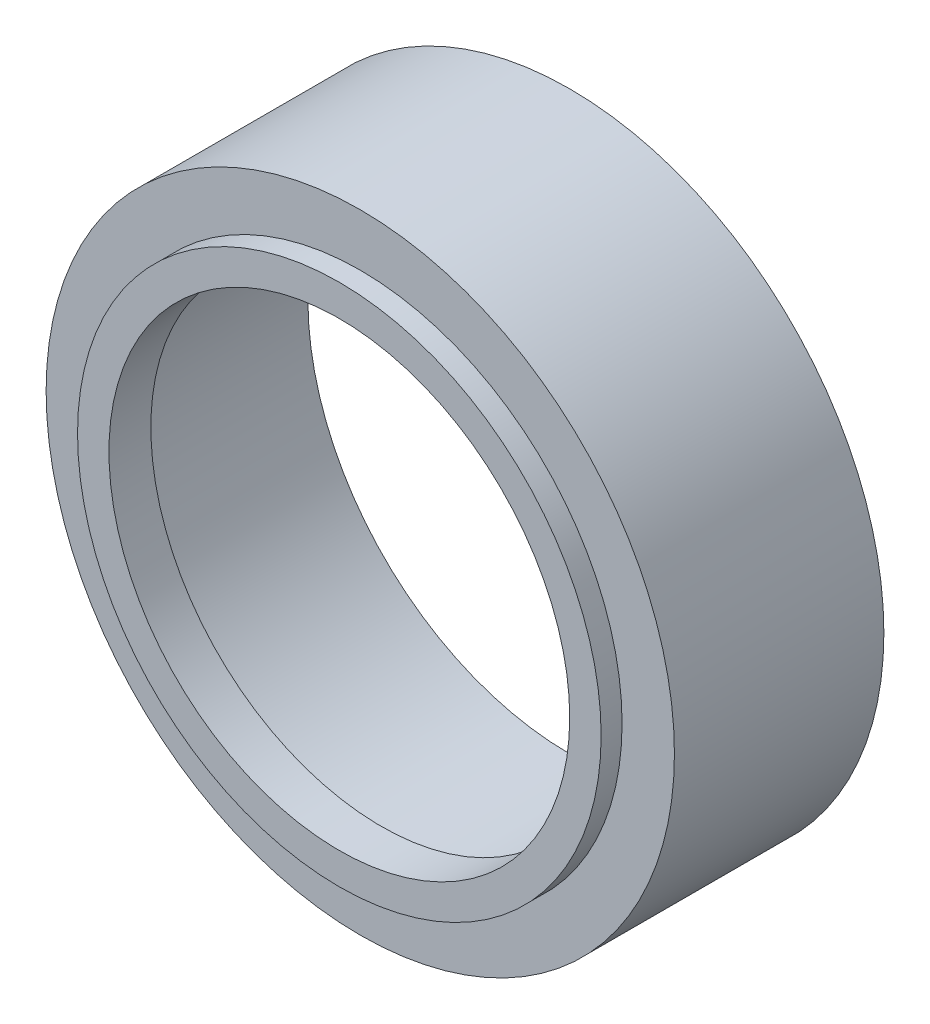
ISO-10303-21;
HEADER;
FILE_DESCRIPTION(('STEP AP214'),'2;1');
FILE_NAME('part.step','',(''),(''),'','','');
FILE_SCHEMA(('AUTOMOTIVE_DESIGN { 1 0 10303 214 1 1 1 1 }'));
ENDSEC;
DATA;
#1=APPLICATION_CONTEXT('core data for automotive mechanical design processes');
#2=APPLICATION_PROTOCOL_DEFINITION('international standard','automotive_design',2000,#1);
#3=PRODUCT_CONTEXT('',#1,'mechanical');
#4=PRODUCT('Part','Part','',(#3));
#5=PRODUCT_RELATED_PRODUCT_CATEGORY('part','',(#4));
#6=PRODUCT_DEFINITION_FORMATION('','',#4);
#7=PRODUCT_DEFINITION_CONTEXT('part definition',#1,'design');
#8=PRODUCT_DEFINITION('design','',#6,#7);
#9=PRODUCT_DEFINITION_SHAPE('','',#8);
#10=(LENGTH_UNIT() NAMED_UNIT(*) SI_UNIT(.MILLI.,.METRE.));
#11=(NAMED_UNIT(*) PLANE_ANGLE_UNIT() SI_UNIT($,.RADIAN.));
#12=(NAMED_UNIT(*) SI_UNIT($,.STERADIAN.) SOLID_ANGLE_UNIT());
#13=UNCERTAINTY_MEASURE_WITH_UNIT(LENGTH_MEASURE(1.E-05),#10,'distance_accuracy_value','');
#14=(GEOMETRIC_REPRESENTATION_CONTEXT(3) GLOBAL_UNCERTAINTY_ASSIGNED_CONTEXT((#13)) GLOBAL_UNIT_ASSIGNED_CONTEXT((#10,
#11,#12)) REPRESENTATION_CONTEXT('',''));
#15=CARTESIAN_POINT('',(0.,0.,0.));
#16=DIRECTION('',(0.,0.,1.));
#17=DIRECTION('',(1.,0.,0.));
#18=AXIS2_PLACEMENT_3D('',#15,#16,#17);
#19=CARTESIAN_POINT('',(0.,0.,10.));
#20=DIRECTION('',(0.,0.,-1.));
#21=DIRECTION('',(-1.,0.,0.));
#22=AXIS2_PLACEMENT_3D('',#19,#20,#21);
#23=CYLINDRICAL_SURFACE('',#22,15.);
#24=CARTESIAN_POINT('',(0.,0.,10.));
#25=DIRECTION('',(0.,0.,1.));
#26=DIRECTION('',(1.,0.,0.));
#27=AXIS2_PLACEMENT_3D('',#24,#25,#26);
#28=CIRCLE('',#27,15.);
#29=CARTESIAN_POINT('',(15.,0.,10.));
#30=VERTEX_POINT('',#29);
#31=EDGE_CURVE('E47',#30,#30,#28,.T.);
#32=ORIENTED_EDGE('',*,*,#31,.F.);
#33=EDGE_LOOP('',(#32));
#34=FACE_BOUND('',#33,.T.);
#35=CARTESIAN_POINT('',(0.,0.,0.));
#36=DIRECTION('',(0.,0.,1.));
#37=DIRECTION('',(1.,0.,0.));
#38=AXIS2_PLACEMENT_3D('',#35,#36,#37);
#39=CIRCLE('',#38,15.);
#40=CARTESIAN_POINT('',(15.,0.,0.));
#41=VERTEX_POINT('',#40);
#42=EDGE_CURVE('E42',#41,#41,#39,.T.);
#43=ORIENTED_EDGE('',*,*,#42,.T.);
#44=EDGE_LOOP('',(#43));
#45=FACE_BOUND('',#44,.T.);
#46=ADVANCED_FACE('F39',(#34,#45),#23,.T.);
#47=CARTESIAN_POINT('',(0.,0.,10.));
#48=DIRECTION('',(0.,0.,1.));
#49=DIRECTION('',(1.,0.,0.));
#50=AXIS2_PLACEMENT_3D('',#47,#48,#49);
#51=PLANE('',#50);
#52=CARTESIAN_POINT('',(0.,0.,10.));
#53=DIRECTION('',(0.,0.,1.));
#54=DIRECTION('',(1.,0.,0.));
#55=AXIS2_PLACEMENT_3D('',#52,#53,#54);
#56=CIRCLE('',#55,12.5);
#57=CARTESIAN_POINT('',(12.5,0.,10.));
#58=VERTEX_POINT('',#57);
#59=EDGE_CURVE('E10',#58,#58,#56,.T.);
#60=ORIENTED_EDGE('',*,*,#59,.F.);
#61=EDGE_LOOP('',(#60));
#62=FACE_BOUND('',#61,.T.);
#63=ORIENTED_EDGE('',*,*,#31,.T.);
#64=EDGE_LOOP('',(#63));
#65=FACE_BOUND('',#64,.T.);
#66=ADVANCED_FACE('F88',(#62,#65),#51,.T.);
#67=CARTESIAN_POINT('',(0.,0.,0.));
#68=DIRECTION('',(0.,0.,1.));
#69=DIRECTION('',(1.,0.,0.));
#70=AXIS2_PLACEMENT_3D('',#67,#68,#69);
#71=PLANE('',#70);
#72=CARTESIAN_POINT('',(0.,0.,0.));
#73=DIRECTION('',(0.,0.,-1.));
#74=DIRECTION('',(-1.,0.,0.));
#75=AXIS2_PLACEMENT_3D('',#72,#73,#74);
#76=CIRCLE('',#75,12.5);
#77=CARTESIAN_POINT('',(-12.5,0.,0.));
#78=VERTEX_POINT('',#77);
#79=EDGE_CURVE('E67',#78,#78,#76,.T.);
#80=ORIENTED_EDGE('',*,*,#79,.F.);
#81=EDGE_LOOP('',(#80));
#82=FACE_BOUND('',#81,.T.);
#83=ORIENTED_EDGE('',*,*,#42,.F.);
#84=EDGE_LOOP('',(#83));
#85=FACE_BOUND('',#84,.T.);
#86=ADVANCED_FACE('F84',(#82,#85),#71,.F.);
#87=CARTESIAN_POINT('',(0.,0.,11.));
#88=DIRECTION('',(0.,0.,-1.));
#89=DIRECTION('',(-1.,0.,0.));
#90=AXIS2_PLACEMENT_3D('',#87,#88,#89);
#91=CYLINDRICAL_SURFACE('',#90,12.5);
#92=CARTESIAN_POINT('',(0.,0.,11.));
#93=DIRECTION('',(0.,0.,1.));
#94=DIRECTION('',(1.,0.,0.));
#95=AXIS2_PLACEMENT_3D('',#92,#93,#94);
#96=CIRCLE('',#95,12.5);
#97=CARTESIAN_POINT('',(12.5,0.,11.));
#98=VERTEX_POINT('',#97);
#99=EDGE_CURVE('E54',#98,#98,#96,.T.);
#100=ORIENTED_EDGE('',*,*,#99,.F.);
#101=EDGE_LOOP('',(#100));
#102=FACE_BOUND('',#101,.T.);
#103=ORIENTED_EDGE('',*,*,#59,.T.);
#104=EDGE_LOOP('',(#103));
#105=FACE_BOUND('',#104,.T.);
#106=ADVANCED_FACE('F87',(#102,#105),#91,.T.);
#107=CARTESIAN_POINT('',(0.,0.,11.));
#108=DIRECTION('',(0.,0.,1.));
#109=DIRECTION('',(1.,0.,0.));
#110=AXIS2_PLACEMENT_3D('',#107,#108,#109);
#111=PLANE('',#110);
#112=CARTESIAN_POINT('',(0.,0.,11.));
#113=DIRECTION('',(0.,0.,1.));
#114=DIRECTION('',(1.,0.,0.));
#115=AXIS2_PLACEMENT_3D('',#112,#113,#114);
#116=CIRCLE('',#115,11.);
#117=CARTESIAN_POINT('',(11.,0.,11.));
#118=VERTEX_POINT('',#117);
#119=EDGE_CURVE('E58',#118,#118,#116,.T.);
#120=ORIENTED_EDGE('',*,*,#119,.F.);
#121=EDGE_LOOP('',(#120));
#122=FACE_BOUND('',#121,.T.);
#123=ORIENTED_EDGE('',*,*,#99,.T.);
#124=EDGE_LOOP('',(#123));
#125=FACE_BOUND('',#124,.T.);
#126=ADVANCED_FACE('F108',(#122,#125),#111,.T.);
#127=CARTESIAN_POINT('',(0.,0.,9.));
#128=DIRECTION('',(0.,0.,1.));
#129=DIRECTION('',(1.,0.,0.));
#130=AXIS2_PLACEMENT_3D('',#127,#128,#129);
#131=CYLINDRICAL_SURFACE('',#130,11.);
#132=CARTESIAN_POINT('',(0.,0.,9.));
#133=DIRECTION('',(0.,0.,1.));
#134=DIRECTION('',(1.,0.,0.));
#135=AXIS2_PLACEMENT_3D('',#132,#133,#134);
#136=CIRCLE('',#135,11.);
#137=CARTESIAN_POINT('',(11.,0.,9.));
#138=VERTEX_POINT('',#137);
#139=EDGE_CURVE('E62',#138,#138,#136,.T.);
#140=ORIENTED_EDGE('',*,*,#139,.F.);
#141=EDGE_LOOP('',(#140));
#142=FACE_BOUND('',#141,.T.);
#143=ORIENTED_EDGE('',*,*,#119,.T.);
#144=EDGE_LOOP('',(#143));
#145=FACE_BOUND('',#144,.T.);
#146=ADVANCED_FACE('F112',(#142,#145),#131,.F.);
#147=CARTESIAN_POINT('',(0.,0.,9.));
#148=DIRECTION('',(0.,0.,-1.));
#149=DIRECTION('',(-1.,0.,0.));
#150=AXIS2_PLACEMENT_3D('',#147,#148,#149);
#151=PLANE('',#150);
#152=CARTESIAN_POINT('',(0.,0.,9.));
#153=DIRECTION('',(0.,0.,-1.));
#154=DIRECTION('',(-1.,0.,0.));
#155=AXIS2_PLACEMENT_3D('',#152,#153,#154);
#156=CIRCLE('',#155,12.5);
#157=CARTESIAN_POINT('',(-12.5,0.,9.));
#158=VERTEX_POINT('',#157);
#159=EDGE_CURVE('E66',#158,#158,#156,.T.);
#160=ORIENTED_EDGE('',*,*,#159,.T.);
#161=EDGE_LOOP('',(#160));
#162=FACE_BOUND('',#161,.T.);
#163=ORIENTED_EDGE('',*,*,#139,.T.);
#164=EDGE_LOOP('',(#163));
#165=FACE_BOUND('',#164,.T.);
#166=ADVANCED_FACE('F75',(#162,#165),#151,.T.);
#167=CARTESIAN_POINT('',(0.,0.,9.));
#168=DIRECTION('',(0.,0.,-1.));
#169=DIRECTION('',(-1.,0.,0.));
#170=AXIS2_PLACEMENT_3D('',#167,#168,#169);
#171=CYLINDRICAL_SURFACE('',#170,12.5);
#172=ORIENTED_EDGE('',*,*,#159,.F.);
#173=EDGE_LOOP('',(#172));
#174=FACE_BOUND('',#173,.T.);
#175=ORIENTED_EDGE('',*,*,#79,.T.);
#176=EDGE_LOOP('',(#175));
#177=FACE_BOUND('',#176,.T.);
#178=ADVANCED_FACE('F78',(#174,#177),#171,.F.);
#179=CLOSED_SHELL('',(#46,#66,#86,#106,#126,#146,#166,#178));
#180=MANIFOLD_SOLID_BREP('B2',#179);
#181=ADVANCED_BREP_SHAPE_REPRESENTATION('',(#18,#180),#14);
#182=SHAPE_DEFINITION_REPRESENTATION(#9,#181);
ENDSEC;
END-ISO-10303-21;
